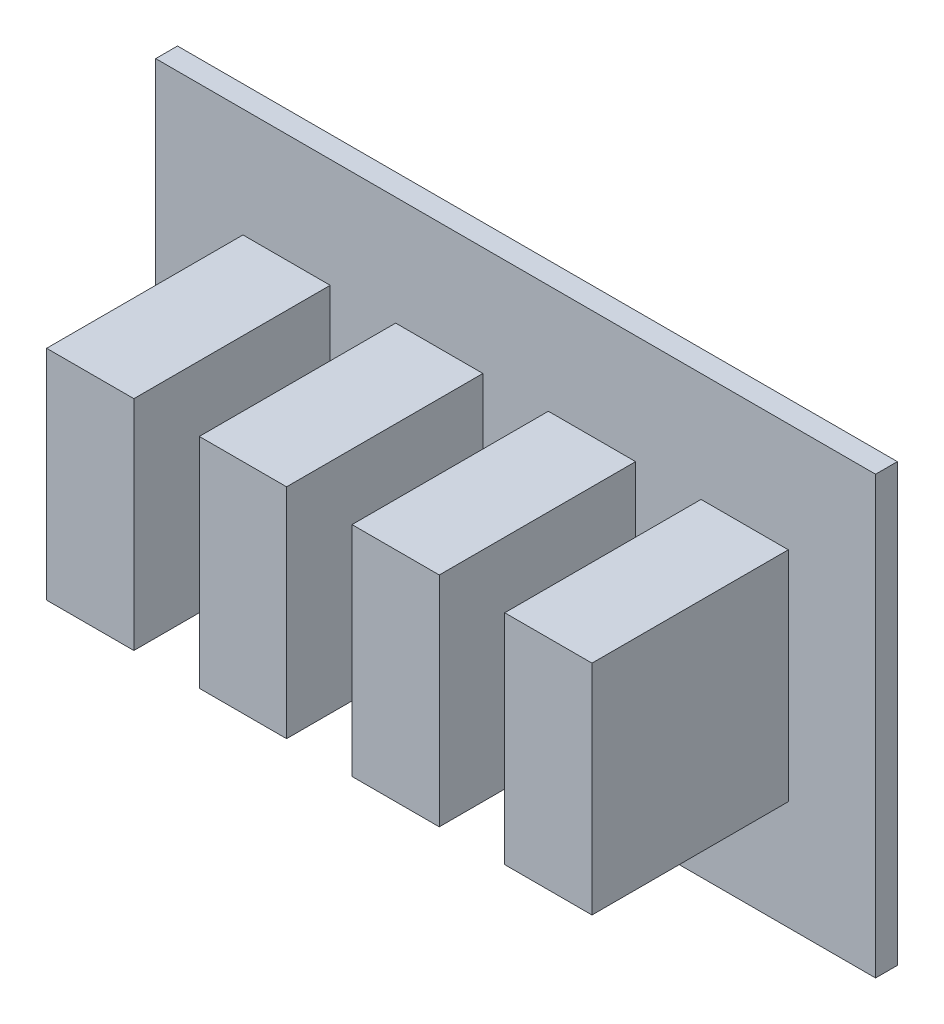
ISO-10303-21;
HEADER;
FILE_DESCRIPTION(('STEP AP214'),'2;1');
FILE_NAME('part.step','',(''),(''),'','','');
FILE_SCHEMA(('AUTOMOTIVE_DESIGN { 1 0 10303 214 1 1 1 1 }'));
ENDSEC;
DATA;
#1=APPLICATION_CONTEXT('core data for automotive mechanical design processes');
#2=APPLICATION_PROTOCOL_DEFINITION('international standard','automotive_design',2000,#1);
#3=PRODUCT_CONTEXT('',#1,'mechanical');
#4=PRODUCT('Part','Part','',(#3));
#5=PRODUCT_RELATED_PRODUCT_CATEGORY('part','',(#4));
#6=PRODUCT_DEFINITION_FORMATION('','',#4);
#7=PRODUCT_DEFINITION_CONTEXT('part definition',#1,'design');
#8=PRODUCT_DEFINITION('design','',#6,#7);
#9=PRODUCT_DEFINITION_SHAPE('','',#8);
#10=(LENGTH_UNIT() NAMED_UNIT(*) SI_UNIT(.MILLI.,.METRE.));
#11=(NAMED_UNIT(*) PLANE_ANGLE_UNIT() SI_UNIT($,.RADIAN.));
#12=(NAMED_UNIT(*) SI_UNIT($,.STERADIAN.) SOLID_ANGLE_UNIT());
#13=UNCERTAINTY_MEASURE_WITH_UNIT(LENGTH_MEASURE(1.E-05),#10,'distance_accuracy_value','');
#14=(GEOMETRIC_REPRESENTATION_CONTEXT(3) GLOBAL_UNCERTAINTY_ASSIGNED_CONTEXT((#13)) GLOBAL_UNIT_ASSIGNED_CONTEXT((#10,
#11,#12)) REPRESENTATION_CONTEXT('',''));
#15=CARTESIAN_POINT('',(0.,0.,0.));
#16=DIRECTION('',(0.,0.,1.));
#17=DIRECTION('',(1.,0.,0.));
#18=AXIS2_PLACEMENT_3D('',#15,#16,#17);
#19=CARTESIAN_POINT('',(0.,0.,0.1));
#20=DIRECTION('',(0.,0.,-1.));
#21=DIRECTION('',(-1.,0.,0.));
#22=AXIS2_PLACEMENT_3D('',#19,#20,#21);
#23=PLANE('',#22);
#24=DIRECTION('',(-1.,0.,0.));
#25=VECTOR('',#24,1.);
#26=CARTESIAN_POINT('',(1.8,1.5,0.1));
#27=LINE('',#26,#25);
#28=CARTESIAN_POINT('',(2.2,1.5,0.1));
#29=VERTEX_POINT('',#28);
#30=CARTESIAN_POINT('',(1.8,1.5,0.1));
#31=VERTEX_POINT('',#30);
#32=EDGE_CURVE('E227',#29,#31,#27,.T.);
#33=ORIENTED_EDGE('',*,*,#32,.F.);
#34=DIRECTION('',(0.,1.,0.));
#35=VECTOR('',#34,1.);
#36=CARTESIAN_POINT('',(2.2,1.5,0.1));
#37=LINE('',#36,#35);
#38=CARTESIAN_POINT('',(2.2,0.5,0.1));
#39=VERTEX_POINT('',#38);
#40=EDGE_CURVE('E217',#39,#29,#37,.T.);
#41=ORIENTED_EDGE('',*,*,#40,.F.);
#42=DIRECTION('',(1.,0.,0.));
#43=VECTOR('',#42,1.);
#44=CARTESIAN_POINT('',(1.8,0.5,0.1));
#45=LINE('',#44,#43);
#46=CARTESIAN_POINT('',(1.8,0.5,0.1));
#47=VERTEX_POINT('',#46);
#48=EDGE_CURVE('E220',#47,#39,#45,.T.);
#49=ORIENTED_EDGE('',*,*,#48,.F.);
#50=DIRECTION('',(0.,-1.,0.));
#51=VECTOR('',#50,1.);
#52=CARTESIAN_POINT('',(1.8,1.5,0.1));
#53=LINE('',#52,#51);
#54=EDGE_CURVE('E224',#31,#47,#53,.T.);
#55=ORIENTED_EDGE('',*,*,#54,.F.);
#56=EDGE_LOOP('',(#33,#41,#49,#55));
#57=FACE_BOUND('',#56,.T.);
#58=DIRECTION('',(0.,-1.,0.));
#59=VECTOR('',#58,1.);
#60=CARTESIAN_POINT('',(0.399999999999999,1.5,0.1));
#61=LINE('',#60,#59);
#62=CARTESIAN_POINT('',(0.399999999999999,1.5,0.1));
#63=VERTEX_POINT('',#62);
#64=CARTESIAN_POINT('',(0.399999999999999,0.5,0.1));
#65=VERTEX_POINT('',#64);
#66=EDGE_CURVE('E263',#63,#65,#61,.T.);
#67=ORIENTED_EDGE('',*,*,#66,.F.);
#68=DIRECTION('',(-1.,0.,0.));
#69=VECTOR('',#68,1.);
#70=CARTESIAN_POINT('',(0.399999999999999,1.5,0.1));
#71=LINE('',#70,#69);
#72=CARTESIAN_POINT('',(0.799999999999999,1.5,0.1));
#73=VERTEX_POINT('',#72);
#74=EDGE_CURVE('E275',#73,#63,#71,.T.);
#75=ORIENTED_EDGE('',*,*,#74,.F.);
#76=DIRECTION('',(0.,1.,0.));
#77=VECTOR('',#76,1.);
#78=CARTESIAN_POINT('',(0.799999999999999,1.5,0.1));
#79=LINE('',#78,#77);
#80=CARTESIAN_POINT('',(0.799999999999999,0.5,0.1));
#81=VERTEX_POINT('',#80);
#82=EDGE_CURVE('E287',#81,#73,#79,.T.);
#83=ORIENTED_EDGE('',*,*,#82,.F.);
#84=DIRECTION('',(1.,0.,0.));
#85=VECTOR('',#84,1.);
#86=CARTESIAN_POINT('',(0.399999999999999,0.5,0.1));
#87=LINE('',#86,#85);
#88=EDGE_CURVE('E284',#65,#81,#87,.T.);
#89=ORIENTED_EDGE('',*,*,#88,.F.);
#90=EDGE_LOOP('',(#67,#75,#83,#89));
#91=FACE_BOUND('',#90,.T.);
#92=DIRECTION('',(0.,-1.,0.));
#93=VECTOR('',#92,1.);
#94=CARTESIAN_POINT('',(0.,0.,0.1));
#95=LINE('',#94,#93);
#96=CARTESIAN_POINT('',(0.,2.,0.1));
#97=VERTEX_POINT('',#96);
#98=CARTESIAN_POINT('',(0.,0.,0.1));
#99=VERTEX_POINT('',#98);
#100=EDGE_CURVE('E304',#97,#99,#95,.T.);
#101=ORIENTED_EDGE('',*,*,#100,.T.);
#102=DIRECTION('',(1.,0.,0.));
#103=VECTOR('',#102,1.);
#104=CARTESIAN_POINT('',(0.,0.,0.1));
#105=LINE('',#104,#103);
#106=CARTESIAN_POINT('',(3.3,0.,0.1));
#107=VERTEX_POINT('',#106);
#108=EDGE_CURVE('E307',#99,#107,#105,.T.);
#109=ORIENTED_EDGE('',*,*,#108,.T.);
#110=DIRECTION('',(0.,1.,0.));
#111=VECTOR('',#110,1.);
#112=CARTESIAN_POINT('',(3.3,0.,0.1));
#113=LINE('',#112,#111);
#114=CARTESIAN_POINT('',(3.3,2.,0.1));
#115=VERTEX_POINT('',#114);
#116=EDGE_CURVE('E310',#107,#115,#113,.T.);
#117=ORIENTED_EDGE('',*,*,#116,.T.);
#118=DIRECTION('',(-1.,0.,0.));
#119=VECTOR('',#118,1.);
#120=CARTESIAN_POINT('',(0.,2.,0.1));
#121=LINE('',#120,#119);
#122=EDGE_CURVE('E312',#115,#97,#121,.T.);
#123=ORIENTED_EDGE('',*,*,#122,.T.);
#124=EDGE_LOOP('',(#101,#109,#117,#123));
#125=FACE_BOUND('',#124,.T.);
#126=DIRECTION('',(-1.,0.,0.));
#127=VECTOR('',#126,1.);
#128=CARTESIAN_POINT('',(1.1,1.5,0.1));
#129=LINE('',#128,#127);
#130=CARTESIAN_POINT('',(1.5,1.5,0.1));
#131=VERTEX_POINT('',#130);
#132=CARTESIAN_POINT('',(1.1,1.5,0.1));
#133=VERTEX_POINT('',#132);
#134=EDGE_CURVE('E260',#131,#133,#129,.T.);
#135=ORIENTED_EDGE('',*,*,#134,.F.);
#136=DIRECTION('',(0.,1.,0.));
#137=VECTOR('',#136,1.);
#138=CARTESIAN_POINT('',(1.5,1.5,0.1));
#139=LINE('',#138,#137);
#140=CARTESIAN_POINT('',(1.5,0.5,0.1));
#141=VERTEX_POINT('',#140);
#142=EDGE_CURVE('E250',#141,#131,#139,.T.);
#143=ORIENTED_EDGE('',*,*,#142,.F.);
#144=DIRECTION('',(1.,0.,0.));
#145=VECTOR('',#144,1.);
#146=CARTESIAN_POINT('',(1.1,0.5,0.1));
#147=LINE('',#146,#145);
#148=CARTESIAN_POINT('',(1.1,0.5,0.1));
#149=VERTEX_POINT('',#148);
#150=EDGE_CURVE('E253',#149,#141,#147,.T.);
#151=ORIENTED_EDGE('',*,*,#150,.F.);
#152=DIRECTION('',(0.,-1.,0.));
#153=VECTOR('',#152,1.);
#154=CARTESIAN_POINT('',(1.1,1.5,0.1));
#155=LINE('',#154,#153);
#156=EDGE_CURVE('E257',#133,#149,#155,.T.);
#157=ORIENTED_EDGE('',*,*,#156,.F.);
#158=EDGE_LOOP('',(#135,#143,#151,#157));
#159=FACE_BOUND('',#158,.T.);
#160=DIRECTION('',(-1.,0.,0.));
#161=VECTOR('',#160,1.);
#162=CARTESIAN_POINT('',(2.5,1.5,0.1));
#163=LINE('',#162,#161);
#164=CARTESIAN_POINT('',(2.9,1.5,0.1));
#165=VERTEX_POINT('',#164);
#166=CARTESIAN_POINT('',(2.5,1.5,0.1));
#167=VERTEX_POINT('',#166);
#168=EDGE_CURVE('E170',#165,#167,#163,.T.);
#169=ORIENTED_EDGE('',*,*,#168,.F.);
#170=DIRECTION('',(0.,1.,0.));
#171=VECTOR('',#170,1.);
#172=CARTESIAN_POINT('',(2.9,1.5,0.1));
#173=LINE('',#172,#171);
#174=CARTESIAN_POINT('',(2.9,0.5,0.1));
#175=VERTEX_POINT('',#174);
#176=EDGE_CURVE('E172',#175,#165,#173,.T.);
#177=ORIENTED_EDGE('',*,*,#176,.F.);
#178=DIRECTION('',(1.,0.,0.));
#179=VECTOR('',#178,1.);
#180=CARTESIAN_POINT('',(2.5,0.5,0.1));
#181=LINE('',#180,#179);
#182=CARTESIAN_POINT('',(2.5,0.5,0.1));
#183=VERTEX_POINT('',#182);
#184=EDGE_CURVE('E57',#183,#175,#181,.T.);
#185=ORIENTED_EDGE('',*,*,#184,.F.);
#186=DIRECTION('',(0.,-1.,0.));
#187=VECTOR('',#186,1.);
#188=CARTESIAN_POINT('',(2.5,1.5,0.1));
#189=LINE('',#188,#187);
#190=EDGE_CURVE('E52',#167,#183,#189,.T.);
#191=ORIENTED_EDGE('',*,*,#190,.F.);
#192=EDGE_LOOP('',(#169,#177,#185,#191));
#193=FACE_BOUND('',#192,.T.);
#194=ADVANCED_FACE('F37',(#57,#91,#125,#159,#193),#23,.F.);
#195=CARTESIAN_POINT('',(0.,0.,0.1));
#196=DIRECTION('',(1.,0.,0.));
#197=DIRECTION('',(0.,1.,0.));
#198=AXIS2_PLACEMENT_3D('',#195,#196,#197);
#199=PLANE('',#198);
#200=DIRECTION('',(0.,-1.,0.));
#201=VECTOR('',#200,1.);
#202=CARTESIAN_POINT('',(0.,0.,0.));
#203=LINE('',#202,#201);
#204=CARTESIAN_POINT('',(0.,2.,0.));
#205=VERTEX_POINT('',#204);
#206=CARTESIAN_POINT('',(0.,0.,0.));
#207=VERTEX_POINT('',#206);
#208=EDGE_CURVE('E303',#205,#207,#203,.T.);
#209=ORIENTED_EDGE('',*,*,#208,.T.);
#210=DIRECTION('',(0.,0.,-1.));
#211=VECTOR('',#210,1.);
#212=CARTESIAN_POINT('',(0.,0.,0.1));
#213=LINE('',#212,#211);
#214=EDGE_CURVE('E11',#99,#207,#213,.T.);
#215=ORIENTED_EDGE('',*,*,#214,.F.);
#216=ORIENTED_EDGE('',*,*,#100,.F.);
#217=DIRECTION('',(0.,0.,-1.));
#218=VECTOR('',#217,1.);
#219=CARTESIAN_POINT('',(0.,2.,0.1));
#220=LINE('',#219,#218);
#221=EDGE_CURVE('E314',#97,#205,#220,.T.);
#222=ORIENTED_EDGE('',*,*,#221,.T.);
#223=EDGE_LOOP('',(#209,#215,#216,#222));
#224=FACE_BOUND('',#223,.T.);
#225=ADVANCED_FACE('F39',(#224),#199,.F.);
#226=CARTESIAN_POINT('',(0.,0.,0.1));
#227=DIRECTION('',(0.,1.,0.));
#228=DIRECTION('',(0.,0.,1.));
#229=AXIS2_PLACEMENT_3D('',#226,#227,#228);
#230=PLANE('',#229);
#231=DIRECTION('',(1.,0.,0.));
#232=VECTOR('',#231,1.);
#233=CARTESIAN_POINT('',(0.,0.,0.));
#234=LINE('',#233,#232);
#235=CARTESIAN_POINT('',(3.3,0.,0.));
#236=VERTEX_POINT('',#235);
#237=EDGE_CURVE('E317',#207,#236,#234,.T.);
#238=ORIENTED_EDGE('',*,*,#237,.T.);
#239=DIRECTION('',(0.,0.,-1.));
#240=VECTOR('',#239,1.);
#241=CARTESIAN_POINT('',(3.3,0.,0.1));
#242=LINE('',#241,#240);
#243=EDGE_CURVE('E45',#107,#236,#242,.T.);
#244=ORIENTED_EDGE('',*,*,#243,.F.);
#245=ORIENTED_EDGE('',*,*,#108,.F.);
#246=ORIENTED_EDGE('',*,*,#214,.T.);
#247=EDGE_LOOP('',(#238,#244,#245,#246));
#248=FACE_BOUND('',#247,.T.);
#249=ADVANCED_FACE('F347',(#248),#230,.F.);
#250=CARTESIAN_POINT('',(3.3,0.,0.1));
#251=DIRECTION('',(-1.,0.,0.));
#252=DIRECTION('',(0.,-1.,0.));
#253=AXIS2_PLACEMENT_3D('',#250,#251,#252);
#254=PLANE('',#253);
#255=DIRECTION('',(0.,1.,0.));
#256=VECTOR('',#255,1.);
#257=CARTESIAN_POINT('',(3.3,0.,0.));
#258=LINE('',#257,#256);
#259=CARTESIAN_POINT('',(3.3,2.,0.));
#260=VERTEX_POINT('',#259);
#261=EDGE_CURVE('E319',#236,#260,#258,.T.);
#262=ORIENTED_EDGE('',*,*,#261,.T.);
#263=DIRECTION('',(0.,0.,-1.));
#264=VECTOR('',#263,1.);
#265=CARTESIAN_POINT('',(3.3,2.,0.1));
#266=LINE('',#265,#264);
#267=EDGE_CURVE('E324',#115,#260,#266,.T.);
#268=ORIENTED_EDGE('',*,*,#267,.F.);
#269=ORIENTED_EDGE('',*,*,#116,.F.);
#270=ORIENTED_EDGE('',*,*,#243,.T.);
#271=EDGE_LOOP('',(#262,#268,#269,#270));
#272=FACE_BOUND('',#271,.T.);
#273=ADVANCED_FACE('F331',(#272),#254,.F.);
#274=CARTESIAN_POINT('',(0.,2.,0.1));
#275=DIRECTION('',(0.,-1.,0.));
#276=DIRECTION('',(0.,0.,-1.));
#277=AXIS2_PLACEMENT_3D('',#274,#275,#276);
#278=PLANE('',#277);
#279=DIRECTION('',(-1.,0.,0.));
#280=VECTOR('',#279,1.);
#281=CARTESIAN_POINT('',(0.,2.,0.));
#282=LINE('',#281,#280);
#283=EDGE_CURVE('E308',#260,#205,#282,.T.);
#284=ORIENTED_EDGE('',*,*,#283,.T.);
#285=ORIENTED_EDGE('',*,*,#221,.F.);
#286=ORIENTED_EDGE('',*,*,#122,.F.);
#287=ORIENTED_EDGE('',*,*,#267,.T.);
#288=EDGE_LOOP('',(#284,#285,#286,#287));
#289=FACE_BOUND('',#288,.T.);
#290=ADVANCED_FACE('F340',(#289),#278,.F.);
#291=CARTESIAN_POINT('',(0.,0.,0.));
#292=DIRECTION('',(0.,0.,-1.));
#293=DIRECTION('',(-1.,0.,0.));
#294=AXIS2_PLACEMENT_3D('',#291,#292,#293);
#295=PLANE('',#294);
#296=ORIENTED_EDGE('',*,*,#208,.F.);
#297=ORIENTED_EDGE('',*,*,#283,.F.);
#298=ORIENTED_EDGE('',*,*,#261,.F.);
#299=ORIENTED_EDGE('',*,*,#237,.F.);
#300=EDGE_LOOP('',(#296,#297,#298,#299));
#301=FACE_BOUND('',#300,.T.);
#302=ADVANCED_FACE('F337',(#301),#295,.T.);
#303=CARTESIAN_POINT('',(0.399999999999999,1.5,1.));
#304=DIRECTION('',(1.,0.,0.));
#305=DIRECTION('',(0.,0.,-1.));
#306=AXIS2_PLACEMENT_3D('',#303,#304,#305);
#307=PLANE('',#306);
#308=ORIENTED_EDGE('',*,*,#66,.T.);
#309=DIRECTION('',(0.,0.,-1.));
#310=VECTOR('',#309,1.);
#311=CARTESIAN_POINT('',(0.399999999999999,0.5,1.));
#312=LINE('',#311,#310);
#313=CARTESIAN_POINT('',(0.399999999999999,0.5,1.));
#314=VERTEX_POINT('',#313);
#315=EDGE_CURVE('E300',#314,#65,#312,.T.);
#316=ORIENTED_EDGE('',*,*,#315,.F.);
#317=DIRECTION('',(0.,-1.,0.));
#318=VECTOR('',#317,1.);
#319=CARTESIAN_POINT('',(0.399999999999999,1.5,1.));
#320=LINE('',#319,#318);
#321=CARTESIAN_POINT('',(0.399999999999999,1.5,1.));
#322=VERTEX_POINT('',#321);
#323=EDGE_CURVE('E271',#322,#314,#320,.T.);
#324=ORIENTED_EDGE('',*,*,#323,.F.);
#325=DIRECTION('',(0.,0.,-1.));
#326=VECTOR('',#325,1.);
#327=CARTESIAN_POINT('',(0.399999999999999,1.5,1.));
#328=LINE('',#327,#326);
#329=EDGE_CURVE('E281',#322,#63,#328,.T.);
#330=ORIENTED_EDGE('',*,*,#329,.T.);
#331=EDGE_LOOP('',(#308,#316,#324,#330));
#332=FACE_BOUND('',#331,.T.);
#333=ADVANCED_FACE('F362',(#332),#307,.F.);
#334=CARTESIAN_POINT('',(0.399999999999999,0.5,1.));
#335=DIRECTION('',(0.,1.,0.));
#336=DIRECTION('',(0.,0.,1.));
#337=AXIS2_PLACEMENT_3D('',#334,#335,#336);
#338=PLANE('',#337);
#339=ORIENTED_EDGE('',*,*,#88,.T.);
#340=DIRECTION('',(0.,0.,-1.));
#341=VECTOR('',#340,1.);
#342=CARTESIAN_POINT('',(0.799999999999999,0.5,1.));
#343=LINE('',#342,#341);
#344=CARTESIAN_POINT('',(0.799999999999999,0.5,1.));
#345=VERTEX_POINT('',#344);
#346=EDGE_CURVE('E297',#345,#81,#343,.T.);
#347=ORIENTED_EDGE('',*,*,#346,.F.);
#348=DIRECTION('',(1.,0.,0.));
#349=VECTOR('',#348,1.);
#350=CARTESIAN_POINT('',(0.399999999999999,0.5,1.));
#351=LINE('',#350,#349);
#352=EDGE_CURVE('E274',#314,#345,#351,.T.);
#353=ORIENTED_EDGE('',*,*,#352,.F.);
#354=ORIENTED_EDGE('',*,*,#315,.T.);
#355=EDGE_LOOP('',(#339,#347,#353,#354));
#356=FACE_BOUND('',#355,.T.);
#357=ADVANCED_FACE('F381',(#356),#338,.F.);
#358=CARTESIAN_POINT('',(0.799999999999999,1.5,1.));
#359=DIRECTION('',(-1.,0.,0.));
#360=DIRECTION('',(0.,0.,1.));
#361=AXIS2_PLACEMENT_3D('',#358,#359,#360);
#362=PLANE('',#361);
#363=ORIENTED_EDGE('',*,*,#82,.T.);
#364=DIRECTION('',(0.,0.,-1.));
#365=VECTOR('',#364,1.);
#366=CARTESIAN_POINT('',(0.799999999999999,1.5,1.));
#367=LINE('',#366,#365);
#368=CARTESIAN_POINT('',(0.799999999999999,1.5,1.));
#369=VERTEX_POINT('',#368);
#370=EDGE_CURVE('E294',#369,#73,#367,.T.);
#371=ORIENTED_EDGE('',*,*,#370,.F.);
#372=DIRECTION('',(0.,1.,0.));
#373=VECTOR('',#372,1.);
#374=CARTESIAN_POINT('',(0.799999999999999,1.5,1.));
#375=LINE('',#374,#373);
#376=EDGE_CURVE('E277',#345,#369,#375,.T.);
#377=ORIENTED_EDGE('',*,*,#376,.F.);
#378=ORIENTED_EDGE('',*,*,#346,.T.);
#379=EDGE_LOOP('',(#363,#371,#377,#378));
#380=FACE_BOUND('',#379,.T.);
#381=ADVANCED_FACE('F388',(#380),#362,.F.);
#382=CARTESIAN_POINT('',(0.399999999999999,1.5,1.));
#383=DIRECTION('',(0.,-1.,0.));
#384=DIRECTION('',(0.,0.,-1.));
#385=AXIS2_PLACEMENT_3D('',#382,#383,#384);
#386=PLANE('',#385);
#387=ORIENTED_EDGE('',*,*,#74,.T.);
#388=ORIENTED_EDGE('',*,*,#329,.F.);
#389=DIRECTION('',(-1.,0.,0.));
#390=VECTOR('',#389,1.);
#391=CARTESIAN_POINT('',(0.399999999999999,1.5,1.));
#392=LINE('',#391,#390);
#393=EDGE_CURVE('E279',#369,#322,#392,.T.);
#394=ORIENTED_EDGE('',*,*,#393,.F.);
#395=ORIENTED_EDGE('',*,*,#370,.T.);
#396=EDGE_LOOP('',(#387,#388,#394,#395));
#397=FACE_BOUND('',#396,.T.);
#398=ADVANCED_FACE('F395',(#397),#386,.F.);
#399=CARTESIAN_POINT('',(0.,0.,1.));
#400=DIRECTION('',(0.,0.,1.));
#401=DIRECTION('',(1.,0.,0.));
#402=AXIS2_PLACEMENT_3D('',#399,#400,#401);
#403=PLANE('',#402);
#404=ORIENTED_EDGE('',*,*,#323,.T.);
#405=ORIENTED_EDGE('',*,*,#352,.T.);
#406=ORIENTED_EDGE('',*,*,#376,.T.);
#407=ORIENTED_EDGE('',*,*,#393,.T.);
#408=EDGE_LOOP('',(#404,#405,#406,#407));
#409=FACE_BOUND('',#408,.T.);
#410=ADVANCED_FACE('F403',(#409),#403,.T.);
#411=CARTESIAN_POINT('',(1.1,1.5,1.));
#412=DIRECTION('',(0.,-1.,0.));
#413=DIRECTION('',(0.,0.,-1.));
#414=AXIS2_PLACEMENT_3D('',#411,#412,#413);
#415=PLANE('',#414);
#416=ORIENTED_EDGE('',*,*,#134,.T.);
#417=DIRECTION('',(0.,0.,-1.));
#418=VECTOR('',#417,1.);
#419=CARTESIAN_POINT('',(1.1,1.5,1.));
#420=LINE('',#419,#418);
#421=CARTESIAN_POINT('',(1.1,1.5,1.));
#422=VERTEX_POINT('',#421);
#423=EDGE_CURVE('E230',#422,#133,#420,.T.);
#424=ORIENTED_EDGE('',*,*,#423,.F.);
#425=DIRECTION('',(-1.,0.,0.));
#426=VECTOR('',#425,1.);
#427=CARTESIAN_POINT('',(1.1,1.5,1.));
#428=LINE('',#427,#426);
#429=CARTESIAN_POINT('',(1.5,1.5,1.));
#430=VERTEX_POINT('',#429);
#431=EDGE_CURVE('E254',#430,#422,#428,.T.);
#432=ORIENTED_EDGE('',*,*,#431,.F.);
#433=DIRECTION('',(0.,0.,-1.));
#434=VECTOR('',#433,1.);
#435=CARTESIAN_POINT('',(1.5,1.5,1.));
#436=LINE('',#435,#434);
#437=EDGE_CURVE('E246',#430,#131,#436,.T.);
#438=ORIENTED_EDGE('',*,*,#437,.T.);
#439=EDGE_LOOP('',(#416,#424,#432,#438));
#440=FACE_BOUND('',#439,.T.);
#441=ADVANCED_FACE('F411',(#440),#415,.F.);
#442=CARTESIAN_POINT('',(1.1,1.5,1.));
#443=DIRECTION('',(1.,0.,0.));
#444=DIRECTION('',(0.,0.,-1.));
#445=AXIS2_PLACEMENT_3D('',#442,#443,#444);
#446=PLANE('',#445);
#447=ORIENTED_EDGE('',*,*,#156,.T.);
#448=DIRECTION('',(0.,0.,-1.));
#449=VECTOR('',#448,1.);
#450=CARTESIAN_POINT('',(1.1,0.5,1.));
#451=LINE('',#450,#449);
#452=CARTESIAN_POINT('',(1.1,0.5,1.));
#453=VERTEX_POINT('',#452);
#454=EDGE_CURVE('E240',#453,#149,#451,.T.);
#455=ORIENTED_EDGE('',*,*,#454,.F.);
#456=DIRECTION('',(0.,-1.,0.));
#457=VECTOR('',#456,1.);
#458=CARTESIAN_POINT('',(1.1,1.5,1.));
#459=LINE('',#458,#457);
#460=EDGE_CURVE('E267',#422,#453,#459,.T.);
#461=ORIENTED_EDGE('',*,*,#460,.F.);
#462=ORIENTED_EDGE('',*,*,#423,.T.);
#463=EDGE_LOOP('',(#447,#455,#461,#462));
#464=FACE_BOUND('',#463,.T.);
#465=ADVANCED_FACE('F419',(#464),#446,.F.);
#466=CARTESIAN_POINT('',(1.1,0.5,1.));
#467=DIRECTION('',(0.,1.,0.));
#468=DIRECTION('',(0.,0.,1.));
#469=AXIS2_PLACEMENT_3D('',#466,#467,#468);
#470=PLANE('',#469);
#471=ORIENTED_EDGE('',*,*,#150,.T.);
#472=DIRECTION('',(0.,0.,-1.));
#473=VECTOR('',#472,1.);
#474=CARTESIAN_POINT('',(1.5,0.5,1.));
#475=LINE('',#474,#473);
#476=CARTESIAN_POINT('',(1.5,0.5,1.));
#477=VERTEX_POINT('',#476);
#478=EDGE_CURVE('E243',#477,#141,#475,.T.);
#479=ORIENTED_EDGE('',*,*,#478,.F.);
#480=DIRECTION('',(1.,0.,0.));
#481=VECTOR('',#480,1.);
#482=CARTESIAN_POINT('',(1.1,0.5,1.));
#483=LINE('',#482,#481);
#484=EDGE_CURVE('E265',#453,#477,#483,.T.);
#485=ORIENTED_EDGE('',*,*,#484,.F.);
#486=ORIENTED_EDGE('',*,*,#454,.T.);
#487=EDGE_LOOP('',(#471,#479,#485,#486));
#488=FACE_BOUND('',#487,.T.);
#489=ADVANCED_FACE('F427',(#488),#470,.F.);
#490=CARTESIAN_POINT('',(1.5,1.5,1.));
#491=DIRECTION('',(-1.,0.,0.));
#492=DIRECTION('',(0.,0.,1.));
#493=AXIS2_PLACEMENT_3D('',#490,#491,#492);
#494=PLANE('',#493);
#495=ORIENTED_EDGE('',*,*,#142,.T.);
#496=ORIENTED_EDGE('',*,*,#437,.F.);
#497=DIRECTION('',(0.,1.,0.));
#498=VECTOR('',#497,1.);
#499=CARTESIAN_POINT('',(1.5,1.5,1.));
#500=LINE('',#499,#498);
#501=EDGE_CURVE('E249',#477,#430,#500,.T.);
#502=ORIENTED_EDGE('',*,*,#501,.F.);
#503=ORIENTED_EDGE('',*,*,#478,.T.);
#504=EDGE_LOOP('',(#495,#496,#502,#503));
#505=FACE_BOUND('',#504,.T.);
#506=ADVANCED_FACE('F435',(#505),#494,.F.);
#507=CARTESIAN_POINT('',(0.,0.,1.));
#508=DIRECTION('',(0.,0.,-1.));
#509=DIRECTION('',(-1.,0.,0.));
#510=AXIS2_PLACEMENT_3D('',#507,#508,#509);
#511=PLANE('',#510);
#512=ORIENTED_EDGE('',*,*,#431,.T.);
#513=ORIENTED_EDGE('',*,*,#460,.T.);
#514=ORIENTED_EDGE('',*,*,#484,.T.);
#515=ORIENTED_EDGE('',*,*,#501,.T.);
#516=EDGE_LOOP('',(#512,#513,#514,#515));
#517=FACE_BOUND('',#516,.T.);
#518=ADVANCED_FACE('F443',(#517),#511,.F.);
#519=CARTESIAN_POINT('',(1.8,1.5,1.));
#520=DIRECTION('',(0.,-1.,0.));
#521=DIRECTION('',(0.,0.,-1.));
#522=AXIS2_PLACEMENT_3D('',#519,#520,#521);
#523=PLANE('',#522);
#524=ORIENTED_EDGE('',*,*,#32,.T.);
#525=DIRECTION('',(0.,0.,-1.));
#526=VECTOR('',#525,1.);
#527=CARTESIAN_POINT('',(1.8,1.5,1.));
#528=LINE('',#527,#526);
#529=CARTESIAN_POINT('',(1.8,1.5,1.));
#530=VERTEX_POINT('',#529);
#531=EDGE_CURVE('E176',#530,#31,#528,.T.);
#532=ORIENTED_EDGE('',*,*,#531,.F.);
#533=DIRECTION('',(-1.,0.,0.));
#534=VECTOR('',#533,1.);
#535=CARTESIAN_POINT('',(1.8,1.5,1.));
#536=LINE('',#535,#534);
#537=CARTESIAN_POINT('',(2.2,1.5,1.));
#538=VERTEX_POINT('',#537);
#539=EDGE_CURVE('E221',#538,#530,#536,.T.);
#540=ORIENTED_EDGE('',*,*,#539,.F.);
#541=DIRECTION('',(0.,0.,-1.));
#542=VECTOR('',#541,1.);
#543=CARTESIAN_POINT('',(2.2,1.5,1.));
#544=LINE('',#543,#542);
#545=EDGE_CURVE('E213',#538,#29,#544,.T.);
#546=ORIENTED_EDGE('',*,*,#545,.T.);
#547=EDGE_LOOP('',(#524,#532,#540,#546));
#548=FACE_BOUND('',#547,.T.);
#549=ADVANCED_FACE('F451',(#548),#523,.F.);
#550=CARTESIAN_POINT('',(1.8,1.5,1.));
#551=DIRECTION('',(1.,0.,0.));
#552=DIRECTION('',(0.,0.,-1.));
#553=AXIS2_PLACEMENT_3D('',#550,#551,#552);
#554=PLANE('',#553);
#555=ORIENTED_EDGE('',*,*,#54,.T.);
#556=DIRECTION('',(0.,0.,-1.));
#557=VECTOR('',#556,1.);
#558=CARTESIAN_POINT('',(1.8,0.5,1.));
#559=LINE('',#558,#557);
#560=CARTESIAN_POINT('',(1.8,0.5,1.));
#561=VERTEX_POINT('',#560);
#562=EDGE_CURVE('E207',#561,#47,#559,.T.);
#563=ORIENTED_EDGE('',*,*,#562,.F.);
#564=DIRECTION('',(0.,-1.,0.));
#565=VECTOR('',#564,1.);
#566=CARTESIAN_POINT('',(1.8,1.5,1.));
#567=LINE('',#566,#565);
#568=EDGE_CURVE('E234',#530,#561,#567,.T.);
#569=ORIENTED_EDGE('',*,*,#568,.F.);
#570=ORIENTED_EDGE('',*,*,#531,.T.);
#571=EDGE_LOOP('',(#555,#563,#569,#570));
#572=FACE_BOUND('',#571,.T.);
#573=ADVANCED_FACE('F459',(#572),#554,.F.);
#574=CARTESIAN_POINT('',(1.8,0.5,1.));
#575=DIRECTION('',(0.,1.,0.));
#576=DIRECTION('',(0.,0.,1.));
#577=AXIS2_PLACEMENT_3D('',#574,#575,#576);
#578=PLANE('',#577);
#579=ORIENTED_EDGE('',*,*,#48,.T.);
#580=DIRECTION('',(0.,0.,-1.));
#581=VECTOR('',#580,1.);
#582=CARTESIAN_POINT('',(2.2,0.5,1.));
#583=LINE('',#582,#581);
#584=CARTESIAN_POINT('',(2.2,0.5,1.));
#585=VERTEX_POINT('',#584);
#586=EDGE_CURVE('E210',#585,#39,#583,.T.);
#587=ORIENTED_EDGE('',*,*,#586,.F.);
#588=DIRECTION('',(1.,0.,0.));
#589=VECTOR('',#588,1.);
#590=CARTESIAN_POINT('',(1.8,0.5,1.));
#591=LINE('',#590,#589);
#592=EDGE_CURVE('E232',#561,#585,#591,.T.);
#593=ORIENTED_EDGE('',*,*,#592,.F.);
#594=ORIENTED_EDGE('',*,*,#562,.T.);
#595=EDGE_LOOP('',(#579,#587,#593,#594));
#596=FACE_BOUND('',#595,.T.);
#597=ADVANCED_FACE('F467',(#596),#578,.F.);
#598=CARTESIAN_POINT('',(2.2,1.5,1.));
#599=DIRECTION('',(-1.,0.,0.));
#600=DIRECTION('',(0.,0.,1.));
#601=AXIS2_PLACEMENT_3D('',#598,#599,#600);
#602=PLANE('',#601);
#603=ORIENTED_EDGE('',*,*,#40,.T.);
#604=ORIENTED_EDGE('',*,*,#545,.F.);
#605=DIRECTION('',(0.,1.,0.));
#606=VECTOR('',#605,1.);
#607=CARTESIAN_POINT('',(2.2,1.5,1.));
#608=LINE('',#607,#606);
#609=EDGE_CURVE('E216',#585,#538,#608,.T.);
#610=ORIENTED_EDGE('',*,*,#609,.F.);
#611=ORIENTED_EDGE('',*,*,#586,.T.);
#612=EDGE_LOOP('',(#603,#604,#610,#611));
#613=FACE_BOUND('',#612,.T.);
#614=ADVANCED_FACE('F475',(#613),#602,.F.);
#615=CARTESIAN_POINT('',(0.,0.,1.));
#616=DIRECTION('',(0.,0.,-1.));
#617=DIRECTION('',(-1.,0.,0.));
#618=AXIS2_PLACEMENT_3D('',#615,#616,#617);
#619=PLANE('',#618);
#620=ORIENTED_EDGE('',*,*,#539,.T.);
#621=ORIENTED_EDGE('',*,*,#568,.T.);
#622=ORIENTED_EDGE('',*,*,#592,.T.);
#623=ORIENTED_EDGE('',*,*,#609,.T.);
#624=EDGE_LOOP('',(#620,#621,#622,#623));
#625=FACE_BOUND('',#624,.T.);
#626=ADVANCED_FACE('F483',(#625),#619,.F.);
#627=CARTESIAN_POINT('',(2.5,1.5,1.));
#628=DIRECTION('',(0.,-1.,0.));
#629=DIRECTION('',(0.,0.,-1.));
#630=AXIS2_PLACEMENT_3D('',#627,#628,#629);
#631=PLANE('',#630);
#632=ORIENTED_EDGE('',*,*,#168,.T.);
#633=DIRECTION('',(0.,0.,-1.));
#634=VECTOR('',#633,1.);
#635=CARTESIAN_POINT('',(2.5,1.5,1.));
#636=LINE('',#635,#634);
#637=CARTESIAN_POINT('',(2.5,1.5,1.));
#638=VERTEX_POINT('',#637);
#639=EDGE_CURVE('E645',#638,#167,#636,.T.);
#640=ORIENTED_EDGE('',*,*,#639,.F.);
#641=DIRECTION('',(-1.,0.,0.));
#642=VECTOR('',#641,1.);
#643=CARTESIAN_POINT('',(2.5,1.5,1.));
#644=LINE('',#643,#642);
#645=CARTESIAN_POINT('',(2.9,1.5,1.));
#646=VERTEX_POINT('',#645);
#647=EDGE_CURVE('E187',#646,#638,#644,.T.);
#648=ORIENTED_EDGE('',*,*,#647,.F.);
#649=DIRECTION('',(0.,0.,-1.));
#650=VECTOR('',#649,1.);
#651=CARTESIAN_POINT('',(2.9,1.5,1.));
#652=LINE('',#651,#650);
#653=EDGE_CURVE('E183',#646,#165,#652,.T.);
#654=ORIENTED_EDGE('',*,*,#653,.T.);
#655=EDGE_LOOP('',(#632,#640,#648,#654));
#656=FACE_BOUND('',#655,.T.);
#657=ADVANCED_FACE('F189',(#656),#631,.F.);
#658=CARTESIAN_POINT('',(2.5,1.5,1.));
#659=DIRECTION('',(1.,0.,0.));
#660=DIRECTION('',(0.,0.,-1.));
#661=AXIS2_PLACEMENT_3D('',#658,#659,#660);
#662=PLANE('',#661);
#663=ORIENTED_EDGE('',*,*,#190,.T.);
#664=DIRECTION('',(0.,0.,-1.));
#665=VECTOR('',#664,1.);
#666=CARTESIAN_POINT('',(2.5,0.5,1.));
#667=LINE('',#666,#665);
#668=CARTESIAN_POINT('',(2.5,0.5,1.));
#669=VERTEX_POINT('',#668);
#670=EDGE_CURVE('E195',#669,#183,#667,.T.);
#671=ORIENTED_EDGE('',*,*,#670,.F.);
#672=DIRECTION('',(0.,-1.,0.));
#673=VECTOR('',#672,1.);
#674=CARTESIAN_POINT('',(2.5,1.5,1.));
#675=LINE('',#674,#673);
#676=EDGE_CURVE('E202',#638,#669,#675,.T.);
#677=ORIENTED_EDGE('',*,*,#676,.F.);
#678=ORIENTED_EDGE('',*,*,#639,.T.);
#679=EDGE_LOOP('',(#663,#671,#677,#678));
#680=FACE_BOUND('',#679,.T.);
#681=ADVANCED_FACE('F498',(#680),#662,.F.);
#682=CARTESIAN_POINT('',(2.5,0.5,1.));
#683=DIRECTION('',(0.,1.,0.));
#684=DIRECTION('',(0.,0.,1.));
#685=AXIS2_PLACEMENT_3D('',#682,#683,#684);
#686=PLANE('',#685);
#687=ORIENTED_EDGE('',*,*,#184,.T.);
#688=DIRECTION('',(0.,0.,-1.));
#689=VECTOR('',#688,1.);
#690=CARTESIAN_POINT('',(2.9,0.5,1.));
#691=LINE('',#690,#689);
#692=CARTESIAN_POINT('',(2.9,0.5,1.));
#693=VERTEX_POINT('',#692);
#694=EDGE_CURVE('E186',#693,#175,#691,.T.);
#695=ORIENTED_EDGE('',*,*,#694,.F.);
#696=DIRECTION('',(1.,0.,0.));
#697=VECTOR('',#696,1.);
#698=CARTESIAN_POINT('',(2.5,0.5,1.));
#699=LINE('',#698,#697);
#700=EDGE_CURVE('E193',#669,#693,#699,.T.);
#701=ORIENTED_EDGE('',*,*,#700,.F.);
#702=ORIENTED_EDGE('',*,*,#670,.T.);
#703=EDGE_LOOP('',(#687,#695,#701,#702));
#704=FACE_BOUND('',#703,.T.);
#705=ADVANCED_FACE('F505',(#704),#686,.F.);
#706=CARTESIAN_POINT('',(2.9,1.5,1.));
#707=DIRECTION('',(-1.,0.,0.));
#708=DIRECTION('',(0.,0.,1.));
#709=AXIS2_PLACEMENT_3D('',#706,#707,#708);
#710=PLANE('',#709);
#711=ORIENTED_EDGE('',*,*,#176,.T.);
#712=ORIENTED_EDGE('',*,*,#653,.F.);
#713=DIRECTION('',(0.,1.,0.));
#714=VECTOR('',#713,1.);
#715=CARTESIAN_POINT('',(2.9,1.5,1.));
#716=LINE('',#715,#714);
#717=EDGE_CURVE('E191',#693,#646,#716,.T.);
#718=ORIENTED_EDGE('',*,*,#717,.F.);
#719=ORIENTED_EDGE('',*,*,#694,.T.);
#720=EDGE_LOOP('',(#711,#712,#718,#719));
#721=FACE_BOUND('',#720,.T.);
#722=ADVANCED_FACE('F181',(#721),#710,.F.);
#723=CARTESIAN_POINT('',(0.,0.,1.));
#724=DIRECTION('',(0.,0.,-1.));
#725=DIRECTION('',(-1.,0.,0.));
#726=AXIS2_PLACEMENT_3D('',#723,#724,#725);
#727=PLANE('',#726);
#728=ORIENTED_EDGE('',*,*,#647,.T.);
#729=ORIENTED_EDGE('',*,*,#676,.T.);
#730=ORIENTED_EDGE('',*,*,#700,.T.);
#731=ORIENTED_EDGE('',*,*,#717,.T.);
#732=EDGE_LOOP('',(#728,#729,#730,#731));
#733=FACE_BOUND('',#732,.T.);
#734=ADVANCED_FACE('F520',(#733),#727,.F.);
#735=CLOSED_SHELL('',(#194,#225,#249,#273,#290,#302,#333,#357,#381,#398,#410,#441,#465,#489,
#506,#518,#549,#573,#597,#614,#626,#657,#681,#705,#722,#734));
#736=MANIFOLD_SOLID_BREP('B2',#735);
#737=ADVANCED_BREP_SHAPE_REPRESENTATION('',(#18,#736),#14);
#738=SHAPE_DEFINITION_REPRESENTATION(#9,#737);
ENDSEC;
END-ISO-10303-21;
